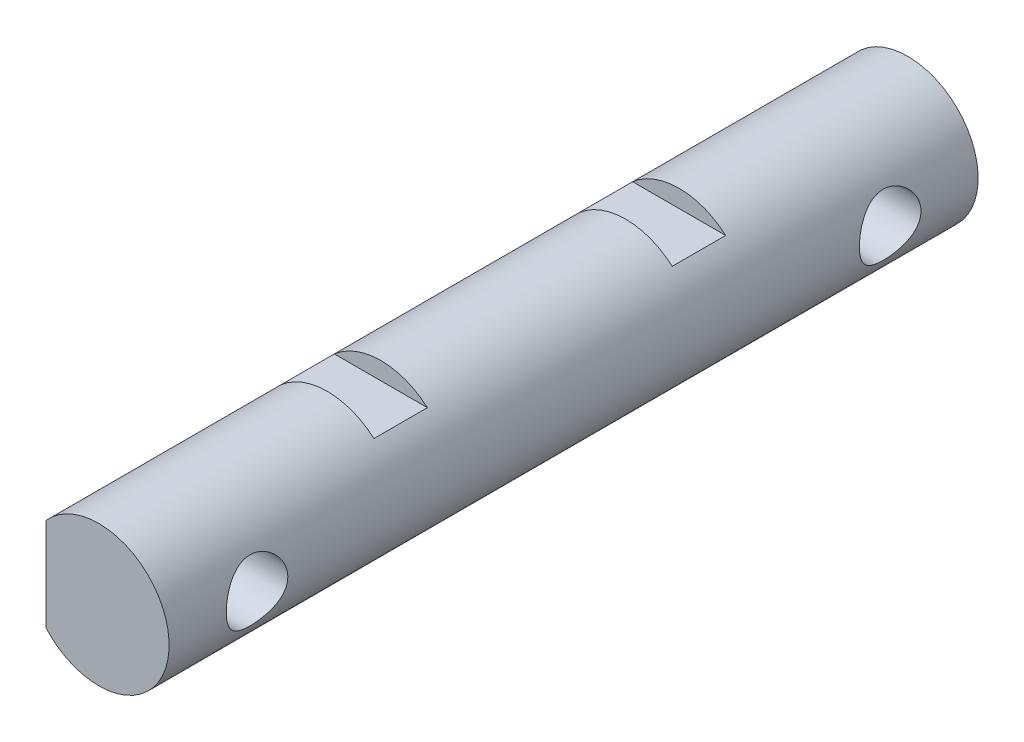
ISO-10303-21;
HEADER;
FILE_DESCRIPTION(('STEP AP214'),'2;1');
FILE_NAME('part.step','',(''),(''),'','','');
FILE_SCHEMA(('AUTOMOTIVE_DESIGN { 1 0 10303 214 1 1 1 1 }'));
ENDSEC;
DATA;
#1=APPLICATION_CONTEXT('core data for automotive mechanical design processes');
#2=APPLICATION_PROTOCOL_DEFINITION('international standard','automotive_design',2000,#1);
#3=PRODUCT_CONTEXT('',#1,'mechanical');
#4=PRODUCT('Part','Part','',(#3));
#5=PRODUCT_RELATED_PRODUCT_CATEGORY('part','',(#4));
#6=PRODUCT_DEFINITION_FORMATION('','',#4);
#7=PRODUCT_DEFINITION_CONTEXT('part definition',#1,'design');
#8=PRODUCT_DEFINITION('design','',#6,#7);
#9=PRODUCT_DEFINITION_SHAPE('','',#8);
#10=(LENGTH_UNIT() NAMED_UNIT(*) SI_UNIT(.MILLI.,.METRE.));
#11=(NAMED_UNIT(*) PLANE_ANGLE_UNIT() SI_UNIT($,.RADIAN.));
#12=(NAMED_UNIT(*) SI_UNIT($,.STERADIAN.) SOLID_ANGLE_UNIT());
#13=UNCERTAINTY_MEASURE_WITH_UNIT(LENGTH_MEASURE(1.E-05),#10,'distance_accuracy_value','');
#14=(GEOMETRIC_REPRESENTATION_CONTEXT(3) GLOBAL_UNCERTAINTY_ASSIGNED_CONTEXT((#13)) GLOBAL_UNIT_ASSIGNED_CONTEXT((#10,
#11,#12)) REPRESENTATION_CONTEXT('',''));
#15=CARTESIAN_POINT('',(0.,0.,0.));
#16=DIRECTION('',(0.,0.,1.));
#17=DIRECTION('',(1.,0.,0.));
#18=AXIS2_PLACEMENT_3D('',#15,#16,#17);
#19=CARTESIAN_POINT('',(0.,0.,115.));
#20=DIRECTION('',(0.,0.,-1.));
#21=DIRECTION('',(-1.,0.,0.));
#22=AXIS2_PLACEMENT_3D('',#19,#20,#21);
#23=CYLINDRICAL_SURFACE('',#22,20.);
#24=CARTESIAN_POINT('',(20.,0.,-81.25));
#25=CARTESIAN_POINT('',(19.9999985682897,0.233416367921879,-81.2500017303169));
#26=CARTESIAN_POINT('',(19.9959028919335,0.466897181927741,-81.2593522904093));
#27=CARTESIAN_POINT('',(19.9796218084749,0.932182866900446,-81.2966637878134));
#28=CARTESIAN_POINT('',(19.9674316527818,1.16398667331765,-81.3246356492544));
#29=CARTESIAN_POINT('',(19.9352486175407,1.6245806234382,-81.3989673695291));
#30=CARTESIAN_POINT('',(19.9152394614096,1.85336344466846,-81.4453655892734));
#31=CARTESIAN_POINT('',(19.8679406236122,2.30579299929019,-81.5560633626645));
#32=CARTESIAN_POINT('',(19.8406504278313,2.52943936878496,-81.6203641804286));
#33=CARTESIAN_POINT('',(19.7795964252379,2.96929138578268,-81.7659679290259));
#34=CARTESIAN_POINT('',(19.745856463693,3.18552108433365,-81.8472083303572));
#35=CARTESIAN_POINT('',(19.6726658379185,3.61007304407575,-82.0261087980079));
#36=CARTESIAN_POINT('',(19.6332149893594,3.81839504975724,-82.1237693943362));
#37=CARTESIAN_POINT('',(19.5495629853909,4.22585197573271,-82.3346705229718));
#38=CARTESIAN_POINT('',(19.5053642657504,4.42499153259712,-82.447903074778));
#39=CARTESIAN_POINT('',(19.413206492756,4.81323611811152,-82.6892186748929));
#40=CARTESIAN_POINT('',(19.3652460736154,5.00233745994071,-82.8173071251928));
#41=CARTESIAN_POINT('',(19.2642312719407,5.37858581774582,-83.094167099455));
#42=CARTESIAN_POINT('',(19.2110422940749,5.56517514897222,-83.2436476552317));
#43=CARTESIAN_POINT('',(19.1030551983712,5.92525275175357,-83.5571074171698));
#44=CARTESIAN_POINT('',(19.0482570130114,6.09874047247459,-83.7210872322982));
#45=CARTESIAN_POINT('',(18.9383820612165,6.43183221506636,-84.0627452772295));
#46=CARTESIAN_POINT('',(18.883305123659,6.59142622484844,-84.240433214284));
#47=CARTESIAN_POINT('',(18.7743404202813,6.89566879546979,-84.6084113335879));
#48=CARTESIAN_POINT('',(18.7204522726647,7.04032221130419,-84.7986973888445));
#49=CARTESIAN_POINT('',(18.6123288995023,7.32155503276978,-85.2019695808427));
#50=CARTESIAN_POINT('',(18.5582436168454,7.4572270137637,-85.415630278337));
#51=CARTESIAN_POINT('',(18.4546966220335,7.70991691228354,-85.8546649649059));
#52=CARTESIAN_POINT('',(18.4052329873663,7.82694260070719,-86.080034022286));
#53=CARTESIAN_POINT('',(18.3125730614567,8.04135028147738,-86.5411258918948));
#54=CARTESIAN_POINT('',(18.2693754498558,8.13873641390775,-86.7768465091947));
#55=CARTESIAN_POINT('',(18.1907994751913,8.31287883922288,-87.257052958165));
#56=CARTESIAN_POINT('',(18.1554204624836,8.38963684620414,-87.5015380596348));
#57=CARTESIAN_POINT('',(18.0954362681584,8.51821340152746,-87.9846194184995));
#58=CARTESIAN_POINT('',(18.0703701388388,8.57111258186955,-88.2228707067972));
#59=CARTESIAN_POINT('',(18.0294324322847,8.65689526382216,-88.7037361082106));
#60=CARTESIAN_POINT('',(18.0135605455664,8.68977943915172,-88.9463500741924));
#61=CARTESIAN_POINT('',(17.9916327120487,8.73508952672777,-89.4337914323461));
#62=CARTESIAN_POINT('',(17.9855714055796,8.74752660959159,-89.6786175424212));
#63=CARTESIAN_POINT('',(17.9834899888763,8.7518054468894,-90.1684851777584));
#64=CARTESIAN_POINT('',(17.9874692647386,8.74364846049057,-90.4135266889346));
#65=CARTESIAN_POINT('',(18.0045331345594,8.70845084190264,-90.8805656542909));
#66=CARTESIAN_POINT('',(18.0168005237286,8.6831043064201,-91.1027233114223));
#67=CARTESIAN_POINT('',(18.0491801392189,8.61559618918829,-91.5439654060083));
#68=CARTESIAN_POINT('',(18.0692950381461,8.57342887872088,-91.7630487700971));
#69=CARTESIAN_POINT('',(18.1167315816365,8.47272838547803,-92.1965626406387));
#70=CARTESIAN_POINT('',(18.1440516602179,8.41419875874098,-92.4109941471848));
#71=CARTESIAN_POINT('',(18.2050933156789,8.28129942266781,-92.8340359275819));
#72=CARTESIAN_POINT('',(18.238817371207,8.20692357871598,-93.0426439114703));
#73=CARTESIAN_POINT('',(18.3125016849266,8.041186429471,-93.457274887532));
#74=CARTESIAN_POINT('',(18.3525817611961,7.94949048772445,-93.6631426430701));
#75=CARTESIAN_POINT('',(18.437328669377,7.75090729425108,-94.066508674859));
#76=CARTESIAN_POINT('',(18.4819970433319,7.64401493061795,-94.264004105613));
#77=CARTESIAN_POINT('',(18.5747583551245,7.41576193817174,-94.6496438941624));
#78=CARTESIAN_POINT('',(18.6228518562144,7.29439892748073,-94.8377867052691));
#79=CARTESIAN_POINT('',(18.7212818714958,7.03793082479619,-95.2038428374211));
#80=CARTESIAN_POINT('',(18.7716185028415,6.90282501457126,-95.3817556230596));
#81=CARTESIAN_POINT('',(18.8781652203288,6.60620846933538,-95.7428323034792));
#82=CARTESIAN_POINT('',(18.9344814201868,6.44340914271176,-95.9249082343613));
#83=CARTESIAN_POINT('',(19.0468698375146,6.10318229259406,-96.2748066540378));
#84=CARTESIAN_POINT('',(19.1029421189477,5.92575888215258,-96.4426331237457));
#85=CARTESIAN_POINT('',(19.2134309096362,5.55707865816541,-96.7632156578912));
#86=CARTESIAN_POINT('',(19.2678463106134,5.36581286228932,-96.9159617819429));
#87=CARTESIAN_POINT('',(19.3735462387861,4.9706653510031,-97.2052002862634));
#88=CARTESIAN_POINT('',(19.4248320109594,4.76678871808314,-97.3416991505637));
#89=CARTESIAN_POINT('',(19.524345510228,4.34153752909835,-97.6011399740506));
#90=CARTESIAN_POINT('',(19.5724451978511,4.11983064347502,-97.7235874438474));
#91=CARTESIAN_POINT('',(19.662553731652,3.66572386612662,-97.949164101266));
#92=CARTESIAN_POINT('',(19.7045652359893,3.43332869974906,-98.0523017255301));
#93=CARTESIAN_POINT('',(19.7812866535513,2.95944070582797,-98.2382630084731));
#94=CARTESIAN_POINT('',(19.8159984579112,2.71795025376601,-98.3210919294585));
#95=CARTESIAN_POINT('',(19.8770833195401,2.22768004101849,-98.4655319416447));
#96=CARTESIAN_POINT('',(19.9034570846219,1.97890090102697,-98.5271448339056));
#97=CARTESIAN_POINT('',(19.9455590411339,1.49330425714449,-98.6249424117708));
#98=CARTESIAN_POINT('',(19.9618912732178,1.25683023419061,-98.6625763750426));
#99=CARTESIAN_POINT('',(19.9861570452404,0.781167692050503,-98.7183489298271));
#100=CARTESIAN_POINT('',(19.9940909660847,0.541979296472109,-98.7364884055134));
#101=CARTESIAN_POINT('',(20.0013359162517,0.0628582888385495,-98.7530562283168));
#102=CARTESIAN_POINT('',(20.0006493576702,-0.177074096255999,-98.7514900892607));
#103=CARTESIAN_POINT('',(19.9906783453544,-0.655817583136368,-98.7286784296819));
#104=CARTESIAN_POINT('',(19.981394120491,-0.894628714600027,-98.7074334330132));
#105=CARTESIAN_POINT('',(19.9552475257964,-1.35588905000023,-98.6472589988417));
#106=CARTESIAN_POINT('',(19.9388402911306,-1.57850362116399,-98.6093903411313));
#107=CARTESIAN_POINT('',(19.8990001453749,-2.01961663268736,-98.5167163572472));
#108=CARTESIAN_POINT('',(19.8755648011915,-2.23811361967429,-98.4619051654578));
#109=CARTESIAN_POINT('',(19.8222427070808,-2.66943964596279,-98.3358899562597));
#110=CARTESIAN_POINT('',(19.7923578883041,-2.88227036051983,-98.2646908454226));
#111=CARTESIAN_POINT('',(19.7268200799402,-3.30114073096866,-98.1064858772219));
#112=CARTESIAN_POINT('',(19.6911648905558,-3.5071777607512,-98.0194739901052));
#113=CARTESIAN_POINT('',(19.6137264975705,-3.91748070243589,-97.8274340405093));
#114=CARTESIAN_POINT('',(19.5717881504754,-4.12149578164153,-97.7219328997091));
#115=CARTESIAN_POINT('',(19.4836198618351,-4.51998007628509,-97.4956521585888));
#116=CARTESIAN_POINT('',(19.4373884570328,-4.71444600218199,-97.374867343816));
#117=CARTESIAN_POINT('',(19.3416970408793,-5.09282313622921,-97.1188372223305));
#118=CARTESIAN_POINT('',(19.2922364212025,-5.27673234335102,-96.9835891879296));
#119=CARTESIAN_POINT('',(19.1912125422397,-5.63308689802626,-96.6994603303996));
#120=CARTESIAN_POINT('',(19.1396491826948,-5.80553169792173,-96.5505788568037));
#121=CARTESIAN_POINT('',(19.031494802915,-6.15122178914183,-96.2277764779103));
#122=CARTESIAN_POINT('',(18.9748270422481,-6.32346569091558,-96.0528073225217));
#123=CARTESIAN_POINT('',(18.8619292479006,-6.65266136761671,-95.68900372024));
#124=CARTESIAN_POINT('',(18.8056990900515,-6.80961763762721,-95.5001733778186));
#125=CARTESIAN_POINT('',(18.6951642097626,-7.10746725066208,-95.1094801621223));
#126=CARTESIAN_POINT('',(18.6408608892102,-7.24834905724263,-94.9076080896822));
#127=CARTESIAN_POINT('',(18.535812825537,-7.51291550604162,-94.492129593069));
#128=CARTESIAN_POINT('',(18.4850666099046,-7.63660728539164,-94.2785280905421));
#129=CARTESIAN_POINT('',(18.387624680319,-7.8683804484288,-93.8359887435348));
#130=CARTESIAN_POINT('',(18.341039902598,-7.97606771254281,-93.6068195181512));
#131=CARTESIAN_POINT('',(18.2548053266785,-8.17150523082147,-93.1389857013622));
#132=CARTESIAN_POINT('',(18.2151522927588,-8.25926479293991,-92.9003256044805));
#133=CARTESIAN_POINT('',(18.1442391070702,-8.41390698160729,-92.4152499053907));
#134=CARTESIAN_POINT('',(18.1129744344038,-8.48080085686747,-92.1688385610405));
#135=CARTESIAN_POINT('',(18.0600496403039,-8.59293128647412,-91.6701288394078));
#136=CARTESIAN_POINT('',(18.0383884809987,-8.63817018116166,-91.4178311013838));
#137=CARTESIAN_POINT('',(18.0069299395797,-8.70354344878578,-90.930661727657));
#138=CARTESIAN_POINT('',(17.9962975967587,-8.72544876294636,-90.6960803000314));
#139=CARTESIAN_POINT('',(17.9842477989203,-8.75025874876469,-90.2256826663951));
#140=CARTESIAN_POINT('',(17.9828298124322,-8.75316451628882,-89.9898665323858));
#141=CARTESIAN_POINT('',(17.9892603439818,-8.73994069061711,-89.5189408167359));
#142=CARTESIAN_POINT('',(17.9971072555545,-8.7238143974404,-89.28383111969));
#143=CARTESIAN_POINT('',(18.0217777612109,-8.67273474775619,-88.816148396522));
#144=CARTESIAN_POINT('',(18.0386012341389,-8.63778164535197,-88.5835753362064));
#145=CARTESIAN_POINT('',(18.0794282620671,-8.55198143492335,-88.1358421066861));
#146=CARTESIAN_POINT('',(18.1029693504652,-8.50215066313961,-87.9204435801649));
#147=CARTESIAN_POINT('',(18.1567945375324,-8.38658886339941,-87.4947470220163));
#148=CARTESIAN_POINT('',(18.1870809425705,-8.32085239627778,-87.2844507623025));
#149=CARTESIAN_POINT('',(18.2535204371937,-8.17407322128961,-86.8702580664674));
#150=CARTESIAN_POINT('',(18.2896726914394,-8.09303269256367,-86.6663607240208));
#151=CARTESIAN_POINT('',(18.3668695319391,-7.91627435755398,-86.2659601792657));
#152=CARTESIAN_POINT('',(18.4079159047127,-7.82055118793234,-86.0694597117179));
#153=CARTESIAN_POINT('',(18.5422447679324,-7.49941530860123,-85.4683551208831));
#154=CARTESIAN_POINT('',(18.6423659519066,-7.24920371149605,-85.0781997453864));
#155=CARTESIAN_POINT('',(18.8497074148774,-6.69154355795391,-84.3432575523569));
#156=CARTESIAN_POINT('',(18.9569305275224,-6.38407206526289,-83.9984890099501));
#157=CARTESIAN_POINT('',(19.1198196151912,-5.87098416262185,-83.5071956711232));
#158=CARTESIAN_POINT('',(19.1766258281905,-5.68314281886581,-83.3421483690425));
#159=CARTESIAN_POINT('',(19.2877874558158,-5.29360126833499,-83.0284316404947));
#160=CARTESIAN_POINT('',(19.3421436486089,-5.09190551406016,-82.8797569918372));
#161=CARTESIAN_POINT('',(19.4469644177556,-4.67564769051748,-82.5997435523725));
#162=CARTESIAN_POINT('',(19.4974261644507,-4.46107646359371,-82.4684173183182));
#163=CARTESIAN_POINT('',(19.5930172766361,-4.02050543970385,-82.2243043991115));
#164=CARTESIAN_POINT('',(19.6381470586734,-3.79450653746997,-82.1115162654446));
#165=CARTESIAN_POINT('',(19.7212623886228,-3.33549324478625,-81.9068344644796));
#166=CARTESIAN_POINT('',(19.7593312612624,-3.10260413019321,-81.8146940140012));
#167=CARTESIAN_POINT('',(19.8279278680938,-2.62879313679702,-81.6504614033736));
#168=CARTESIAN_POINT('',(19.8584564121088,-2.38787212376822,-81.5783670901861));
#169=CARTESIAN_POINT('',(19.9110037914844,-1.90048834138157,-81.4551964866165));
#170=CARTESIAN_POINT('',(19.9330446920011,-1.6540417283201,-81.4040656751191));
#171=CARTESIAN_POINT('',(19.9680480307584,-1.15715012404687,-81.3232043596432));
#172=CARTESIAN_POINT('',(19.9810168662317,-0.906708077963216,-81.2934587753042));
#173=CARTESIAN_POINT('',(19.9928335024629,-0.546384240388737,-81.2663907881835));
#174=CARTESIAN_POINT('',(19.9955189863611,-0.437221175106716,-81.2602464388677));
#175=CARTESIAN_POINT('',(19.9991025786908,-0.218710123374722,-81.2520506207327));
#176=CARTESIAN_POINT('',(20.0000006707965,-0.109362135244817,-81.2499991892978));
#177=CARTESIAN_POINT('',(20.,0.,-81.25));
#178=B_SPLINE_CURVE_WITH_KNOTS('',3,(#24,#25,#26,#27,#28,#29,#30,#31,#32,#33,#34,#35,#36,#37,
#38,#39,#40,#41,#42,#43,#44,#45,#46,#47,#48,#49,#50,#51,#52,#53,#54,#55,#56,#57,#58,#59,#60,#61,
#62,#63,#64,#65,#66,#67,#68,#69,#70,#71,#72,#73,#74,#75,#76,#77,#78,#79,#80,#81,#82,#83,#84,#85,
#86,#87,#88,#89,#90,#91,#92,#93,#94,#95,#96,#97,#98,#99,#100,#101,#102,#103,#104,#105,#106,#107,
#108,#109,#110,#111,#112,#113,#114,#115,#116,#117,#118,#119,#120,#121,#122,#123,#124,#125,#126,
#127,#128,#129,#130,#131,#132,#133,#134,#135,#136,#137,#138,#139,#140,#141,#142,#143,#144,#145,
#146,#147,#148,#149,#150,#151,#152,#153,#154,#155,#156,#157,#158,#159,#160,#161,#162,#163,#164,
#165,#166,#167,#168,#169,#170,#171,#172,#173,#174,#175,#176,#177),.UNSPECIFIED.,.T.,.F.,(4,2,2,
2,2,2,2,2,2,2,2,2,2,2,2,2,2,2,2,2,2,2,2,2,2,2,2,2,2,2,2,2,2,2,2,2,2,2,2,2,2,2,2,2,2,2,2,2,2,2,2,
2,2,2,2,2,2,2,2,2,2,2,2,2,2,2,2,2,2,2,2,2,2,2,2,2,4),(0.,0.700138962448547,1.40068902165195,
2.10270523117984,2.80477102323212,3.50428974134297,4.20383104276542,4.90301516177155,
5.602454324162,6.3364344495926,7.07044541675262,7.8049810227005,8.53927718292008,
9.31474372641262,10.0898862418188,10.864865183401,11.6397797080911,12.3747938090443,
13.1097831675412,13.8443708544322,14.578913628086,15.249931889376,15.9211788774009,
16.5922800959133,17.2636415944116,17.9496241084891,18.6358379278343,19.3221648547531,
20.0085276691972,20.7596400951171,21.5105419853374,22.2619355821616,23.0130282967321,
23.7854301441305,24.5574937307648,25.3293570515791,26.1011548316092,26.8202411588828,
27.539294870575,28.2581473883713,28.9769807707686,29.6554224079058,30.3340991895346,
31.0125730378642,31.6913061478678,32.3909830302794,33.0908992739318,33.7909477517266,
34.4910296470403,35.2461100596148,36.0009677783824,36.7563638861383,37.511445417779,
38.2828087910349,39.0538111265976,39.8243970928256,40.5948997599072,41.3014981388369,
42.0080557618342,42.7144908909413,43.4209164856137,44.0871890279352,44.7536897338687,
45.4200956084324,46.0867454928628,47.5030044483908,48.9198319313131,49.6883182882484,
50.4565588159233,51.2253523832027,51.9940858505524,52.7530728136298,53.5119782268422,
54.2688971911303,55.0252818689775,55.3533136742166,55.6813484756453),.UNSPECIFIED.);
#179=CARTESIAN_POINT('',(20.,0.,-81.25));
#180=VERTEX_POINT('',#179);
#181=EDGE_CURVE('E42',#180,#180,#178,.T.);
#182=ORIENTED_EDGE('',*,*,#181,.T.);
#183=EDGE_LOOP('',(#182));
#184=FACE_BOUND('',#183,.T.);
#185=DIRECTION('',(0.,0.,-1.));
#186=VECTOR('',#185,1.);
#187=CARTESIAN_POINT('',(13.228756555323,15.,115.));
#188=LINE('',#187,#186);
#189=CARTESIAN_POINT('',(13.228756555323,15.,50.));
#190=VERTEX_POINT('',#189);
#191=CARTESIAN_POINT('',(13.228756555323,15.,34.8));
#192=VERTEX_POINT('',#191);
#193=EDGE_CURVE('E204',#190,#192,#188,.T.);
#194=ORIENTED_EDGE('',*,*,#193,.F.);
#195=CARTESIAN_POINT('',(0.,0.,50.));
#196=DIRECTION('',(0.,0.,1.));
#197=DIRECTION('',(1.,0.,0.));
#198=AXIS2_PLACEMENT_3D('',#195,#196,#197);
#199=CIRCLE('',#198,20.);
#200=CARTESIAN_POINT('',(-13.228756555323,15.,50.));
#201=VERTEX_POINT('',#200);
#202=EDGE_CURVE('E196',#190,#201,#199,.T.);
#203=ORIENTED_EDGE('',*,*,#202,.T.);
#204=DIRECTION('',(0.,0.,-1.));
#205=VECTOR('',#204,1.);
#206=CARTESIAN_POINT('',(-13.228756555323,15.,115.));
#207=LINE('',#206,#205);
#208=CARTESIAN_POINT('',(-13.228756555323,15.,34.8));
#209=VERTEX_POINT('',#208);
#210=EDGE_CURVE('E202',#209,#201,#207,.F.);
#211=ORIENTED_EDGE('',*,*,#210,.F.);
#212=CARTESIAN_POINT('',(0.,0.,34.8));
#213=DIRECTION('',(0.,0.,1.));
#214=DIRECTION('',(1.,0.,0.));
#215=AXIS2_PLACEMENT_3D('',#212,#213,#214);
#216=CIRCLE('',#215,20.);
#217=EDGE_CURVE('E200',#192,#209,#216,.T.);
#218=ORIENTED_EDGE('',*,*,#217,.F.);
#219=EDGE_LOOP('',(#194,#203,#211,#218));
#220=FACE_BOUND('',#219,.T.);
#221=DIRECTION('',(0.,0.,-1.));
#222=VECTOR('',#221,1.);
#223=CARTESIAN_POINT('',(-13.228756555323,-15.,115.));
#224=LINE('',#223,#222);
#225=CARTESIAN_POINT('',(-13.228756555323,-15.,50.));
#226=VERTEX_POINT('',#225);
#227=CARTESIAN_POINT('',(-13.228756555323,-15.,34.8));
#228=VERTEX_POINT('',#227);
#229=EDGE_CURVE('E199',#226,#228,#224,.T.);
#230=ORIENTED_EDGE('',*,*,#229,.F.);
#231=CARTESIAN_POINT('',(13.228756555323,-15.,50.));
#232=VERTEX_POINT('',#231);
#233=EDGE_CURVE('E192',#226,#232,#199,.T.);
#234=ORIENTED_EDGE('',*,*,#233,.T.);
#235=DIRECTION('',(0.,0.,-1.));
#236=VECTOR('',#235,1.);
#237=CARTESIAN_POINT('',(13.228756555323,-15.,115.));
#238=LINE('',#237,#236);
#239=CARTESIAN_POINT('',(13.228756555323,-15.,34.8));
#240=VERTEX_POINT('',#239);
#241=EDGE_CURVE('E189',#240,#232,#238,.F.);
#242=ORIENTED_EDGE('',*,*,#241,.F.);
#243=EDGE_CURVE('E195',#228,#240,#216,.T.);
#244=ORIENTED_EDGE('',*,*,#243,.F.);
#245=EDGE_LOOP('',(#230,#234,#242,#244));
#246=FACE_BOUND('',#245,.T.);
#247=CARTESIAN_POINT('',(0.,0.,115.));
#248=DIRECTION('',(0.,0.,1.));
#249=DIRECTION('',(1.,0.,0.));
#250=AXIS2_PLACEMENT_3D('',#247,#248,#249);
#251=CIRCLE('',#250,20.);
#252=CARTESIAN_POINT('',(-15.,-13.228756555323,115.));
#253=VERTEX_POINT('',#252);
#254=CARTESIAN_POINT('',(-15.,13.228756555323,115.));
#255=VERTEX_POINT('',#254);
#256=EDGE_CURVE('E186',#253,#255,#251,.T.);
#257=ORIENTED_EDGE('',*,*,#256,.F.);
#258=DIRECTION('',(0.,0.,1.));
#259=VECTOR('',#258,1.);
#260=CARTESIAN_POINT('',(-15.,-13.228756555323,65.));
#261=LINE('',#260,#259);
#262=CARTESIAN_POINT('',(-15.,-13.228756555323,65.));
#263=VERTEX_POINT('',#262);
#264=EDGE_CURVE('E170',#263,#253,#261,.T.);
#265=ORIENTED_EDGE('',*,*,#264,.F.);
#266=CARTESIAN_POINT('',(0.,0.,65.));
#267=DIRECTION('',(0.,0.,1.));
#268=DIRECTION('',(1.,0.,0.));
#269=AXIS2_PLACEMENT_3D('',#266,#267,#268);
#270=CIRCLE('',#269,20.);
#271=CARTESIAN_POINT('',(-15.,13.228756555323,65.));
#272=VERTEX_POINT('',#271);
#273=EDGE_CURVE('E164',#272,#263,#270,.T.);
#274=ORIENTED_EDGE('',*,*,#273,.F.);
#275=DIRECTION('',(0.,0.,1.));
#276=VECTOR('',#275,1.);
#277=CARTESIAN_POINT('',(-15.,13.228756555323,65.));
#278=LINE('',#277,#276);
#279=EDGE_CURVE('E172',#272,#255,#278,.T.);
#280=ORIENTED_EDGE('',*,*,#279,.T.);
#281=EDGE_LOOP('',(#257,#265,#274,#280));
#282=FACE_BOUND('',#281,.T.);
#283=CARTESIAN_POINT('',(20.,0.,98.75));
#284=CARTESIAN_POINT('',(19.9999985682897,0.233416367921879,98.7499982696831));
#285=CARTESIAN_POINT('',(19.9959028919335,0.466897181927741,98.7406477095907));
#286=CARTESIAN_POINT('',(19.9796218084749,0.932182866900446,98.7033362121866));
#287=CARTESIAN_POINT('',(19.9674316527818,1.16398667331765,98.6753643507456));
#288=CARTESIAN_POINT('',(19.9352486175407,1.6245806234382,98.6010326304709));
#289=CARTESIAN_POINT('',(19.9152394614096,1.85336344466846,98.5546344107266));
#290=CARTESIAN_POINT('',(19.8679406236122,2.30579299929019,98.4439366373355));
#291=CARTESIAN_POINT('',(19.8406504278313,2.52943936878496,98.3796358195714));
#292=CARTESIAN_POINT('',(19.7795964252379,2.96929138578268,98.2340320709741));
#293=CARTESIAN_POINT('',(19.745856463693,3.18552108433365,98.1527916696428));
#294=CARTESIAN_POINT('',(19.6726658379185,3.61007304407575,97.9738912019921));
#295=CARTESIAN_POINT('',(19.6332149893594,3.81839504975724,97.8762306056638));
#296=CARTESIAN_POINT('',(19.5495629853909,4.22585197573271,97.6653294770282));
#297=CARTESIAN_POINT('',(19.5053642657504,4.42499153259711,97.552096925222));
#298=CARTESIAN_POINT('',(19.413206492756,4.81323611811152,97.3107813251071));
#299=CARTESIAN_POINT('',(19.3652460736154,5.00233745994071,97.1826928748072));
#300=CARTESIAN_POINT('',(19.2642312719407,5.37858581774581,96.905832900545));
#301=CARTESIAN_POINT('',(19.2110422940749,5.56517514897221,96.7563523447683));
#302=CARTESIAN_POINT('',(19.1030551983712,5.92525275175356,96.4428925828302));
#303=CARTESIAN_POINT('',(19.0482570130114,6.09874047247459,96.2789127677018));
#304=CARTESIAN_POINT('',(18.9383820612165,6.43183221506635,95.9372547227705));
#305=CARTESIAN_POINT('',(18.883305123659,6.59142622484842,95.759566785716));
#306=CARTESIAN_POINT('',(18.7743404202813,6.89566879546979,95.3915886664121));
#307=CARTESIAN_POINT('',(18.7204522726647,7.04032221130419,95.2013026111555));
#308=CARTESIAN_POINT('',(18.6123288995023,7.32155503276978,94.7980304191572));
#309=CARTESIAN_POINT('',(18.5582436168454,7.4572270137637,94.584369721663));
#310=CARTESIAN_POINT('',(18.4546966220335,7.70991691228354,94.1453350350941));
#311=CARTESIAN_POINT('',(18.4052329873663,7.82694260070719,93.919965977714));
#312=CARTESIAN_POINT('',(18.3125730614567,8.04135028147738,93.4588741081052));
#313=CARTESIAN_POINT('',(18.2693754498558,8.13873641390775,93.2231534908053));
#314=CARTESIAN_POINT('',(18.1907994751913,8.31287883922288,92.742947041835));
#315=CARTESIAN_POINT('',(18.1554204624836,8.38963684620414,92.4984619403652));
#316=CARTESIAN_POINT('',(18.0954362681584,8.51821340152746,92.0153805815005));
#317=CARTESIAN_POINT('',(18.0703701388388,8.57111258186955,91.7771292932028));
#318=CARTESIAN_POINT('',(18.0294324322847,8.65689526382216,91.2962638917894));
#319=CARTESIAN_POINT('',(18.0135605455664,8.68977943915172,91.0536499258076));
#320=CARTESIAN_POINT('',(17.9916327120487,8.73508952672777,90.5662085676539));
#321=CARTESIAN_POINT('',(17.9855714055796,8.74752660959159,90.3213824575788));
#322=CARTESIAN_POINT('',(17.9834899888763,8.7518054468894,89.8315148222416));
#323=CARTESIAN_POINT('',(17.9874692647386,8.74364846049057,89.5864733110653));
#324=CARTESIAN_POINT('',(18.0045331345594,8.70845084190264,89.119434345709));
#325=CARTESIAN_POINT('',(18.0168005237286,8.6831043064201,88.8972766885776));
#326=CARTESIAN_POINT('',(18.0491801392189,8.61559618918829,88.4560345939917));
#327=CARTESIAN_POINT('',(18.0692950381461,8.57342887872088,88.2369512299029));
#328=CARTESIAN_POINT('',(18.1167315816365,8.47272838547803,87.8034373593613));
#329=CARTESIAN_POINT('',(18.1440516602179,8.41419875874098,87.5890058528152));
#330=CARTESIAN_POINT('',(18.2050933156789,8.28129942266781,87.1659640724181));
#331=CARTESIAN_POINT('',(18.238817371207,8.20692357871598,86.9573560885297));
#332=CARTESIAN_POINT('',(18.3125016849266,8.041186429471,86.542725112468));
#333=CARTESIAN_POINT('',(18.3525817611961,7.94949048772445,86.3368573569299));
#334=CARTESIAN_POINT('',(18.437328669377,7.75090729425109,85.933491325141));
#335=CARTESIAN_POINT('',(18.4819970433319,7.64401493061797,85.735995894387));
#336=CARTESIAN_POINT('',(18.5747583551245,7.41576193817175,85.3503561058376));
#337=CARTESIAN_POINT('',(18.6228518562143,7.29439892748074,85.1622132947309));
#338=CARTESIAN_POINT('',(18.7212818714958,7.0379308247962,84.7961571625789));
#339=CARTESIAN_POINT('',(18.7716185028415,6.90282501457126,84.6182443769404));
#340=CARTESIAN_POINT('',(18.8781652203288,6.60620846933538,84.2571676965208));
#341=CARTESIAN_POINT('',(18.9344814201868,6.44340914271176,84.0750917656387));
#342=CARTESIAN_POINT('',(19.0468698375146,6.10318229259406,83.7251933459622));
#343=CARTESIAN_POINT('',(19.1029421189477,5.92575888215258,83.5573668762543));
#344=CARTESIAN_POINT('',(19.2134309096362,5.5570786581654,83.2367843421088));
#345=CARTESIAN_POINT('',(19.2678463106134,5.36581286228931,83.0840382180571));
#346=CARTESIAN_POINT('',(19.3735462387862,4.9706653510031,82.7947997137366));
#347=CARTESIAN_POINT('',(19.4248320109594,4.76678871808314,82.6583008494363));
#348=CARTESIAN_POINT('',(19.524345510228,4.34153752909835,82.3988600259494));
#349=CARTESIAN_POINT('',(19.5724451978511,4.11983064347502,82.2764125561526));
#350=CARTESIAN_POINT('',(19.662553731652,3.66572386612662,82.0508358987339));
#351=CARTESIAN_POINT('',(19.7045652359893,3.43332869974906,81.9476982744698));
#352=CARTESIAN_POINT('',(19.7812866535513,2.95944070582797,81.7617369915269));
#353=CARTESIAN_POINT('',(19.8159984579112,2.71795025376601,81.6789080705415));
#354=CARTESIAN_POINT('',(19.8770833195401,2.22768004101849,81.5344680583553));
#355=CARTESIAN_POINT('',(19.9034570846219,1.97890090102697,81.4728551660944));
#356=CARTESIAN_POINT('',(19.9455590411339,1.49330425714449,81.3750575882292));
#357=CARTESIAN_POINT('',(19.9618912732178,1.25683023419061,81.3374236249573));
#358=CARTESIAN_POINT('',(19.9861570452404,0.781167692050503,81.2816510701729));
#359=CARTESIAN_POINT('',(19.9940909660847,0.541979296472109,81.2635115944866));
#360=CARTESIAN_POINT('',(20.0013359162517,0.0628582888385496,81.2469437716832));
#361=CARTESIAN_POINT('',(20.0006493576702,-0.177074096255999,81.2485099107393));
#362=CARTESIAN_POINT('',(19.9906783453544,-0.655817583136368,81.2713215703181));
#363=CARTESIAN_POINT('',(19.981394120491,-0.894628714600027,81.2925665669868));
#364=CARTESIAN_POINT('',(19.9552475257964,-1.35588905000023,81.3527410011583));
#365=CARTESIAN_POINT('',(19.9388402911306,-1.57850362116399,81.3906096588687));
#366=CARTESIAN_POINT('',(19.8990001453749,-2.01961663268737,81.4832836427527));
#367=CARTESIAN_POINT('',(19.8755648011915,-2.23811361967429,81.5380948345422));
#368=CARTESIAN_POINT('',(19.8222427070808,-2.66943964596279,81.6641100437403));
#369=CARTESIAN_POINT('',(19.7923578883041,-2.88227036051984,81.7353091545774));
#370=CARTESIAN_POINT('',(19.7268200799402,-3.30114073096866,81.8935141227781));
#371=CARTESIAN_POINT('',(19.6911648905558,-3.5071777607512,81.9805260098948));
#372=CARTESIAN_POINT('',(19.6137264975705,-3.91748070243589,82.1725659594907));
#373=CARTESIAN_POINT('',(19.5717881504754,-4.12149578164154,82.2780671002909));
#374=CARTESIAN_POINT('',(19.4836198618351,-4.51998007628509,82.5043478414112));
#375=CARTESIAN_POINT('',(19.4373884570328,-4.714446002182,82.625132656184));
#376=CARTESIAN_POINT('',(19.3416970408793,-5.09282313622921,82.8811627776695));
#377=CARTESIAN_POINT('',(19.2922364212025,-5.27673234335102,83.0164108120703));
#378=CARTESIAN_POINT('',(19.1912125422397,-5.63308689802625,83.3005396696004));
#379=CARTESIAN_POINT('',(19.1396491826948,-5.80553169792172,83.4494211431963));
#380=CARTESIAN_POINT('',(19.031494802915,-6.15122178914183,83.7722235220897));
#381=CARTESIAN_POINT('',(18.9748270422481,-6.32346569091558,83.9471926774783));
#382=CARTESIAN_POINT('',(18.8619292479006,-6.6526613676167,84.31099627976));
#383=CARTESIAN_POINT('',(18.8056990900515,-6.8096176376272,84.4998266221814));
#384=CARTESIAN_POINT('',(18.6951642097626,-7.10746725066206,84.8905198378776));
#385=CARTESIAN_POINT('',(18.6408608892102,-7.24834905724262,85.0923919103178));
#386=CARTESIAN_POINT('',(18.535812825537,-7.51291550604162,85.507870406931));
#387=CARTESIAN_POINT('',(18.4850666099046,-7.63660728539163,85.7214719094579));
#388=CARTESIAN_POINT('',(18.387624680319,-7.8683804484288,86.1640112564652));
#389=CARTESIAN_POINT('',(18.341039902598,-7.97606771254281,86.3931804818488));
#390=CARTESIAN_POINT('',(18.2548053266785,-8.17150523082147,86.8610142986378));
#391=CARTESIAN_POINT('',(18.2151522927588,-8.25926479293991,87.0996743955195));
#392=CARTESIAN_POINT('',(18.1442391070702,-8.41390698160729,87.5847500946093));
#393=CARTESIAN_POINT('',(18.1129744344038,-8.48080085686747,87.8311614389595));
#394=CARTESIAN_POINT('',(18.0600496403039,-8.59293128647412,88.3298711605922));
#395=CARTESIAN_POINT('',(18.0383884809987,-8.63817018116166,88.5821688986162));
#396=CARTESIAN_POINT('',(18.0069299395797,-8.70354344878578,89.0693382723429));
#397=CARTESIAN_POINT('',(17.9962975967587,-8.72544876294636,89.3039196999686));
#398=CARTESIAN_POINT('',(17.9842477989203,-8.75025874876469,89.7743173336049));
#399=CARTESIAN_POINT('',(17.9828298124322,-8.75316451628882,90.0101334676142));
#400=CARTESIAN_POINT('',(17.9892603439818,-8.73994069061711,90.4810591832641));
#401=CARTESIAN_POINT('',(17.9971072555545,-8.7238143974404,90.71616888031));
#402=CARTESIAN_POINT('',(18.0217777612109,-8.67273474775619,91.183851603478));
#403=CARTESIAN_POINT('',(18.0386012341389,-8.63778164535197,91.4164246637936));
#404=CARTESIAN_POINT('',(18.0794282620671,-8.55198143492335,91.8641578933139));
#405=CARTESIAN_POINT('',(18.1029693504652,-8.50215066313961,92.0795564198351));
#406=CARTESIAN_POINT('',(18.1567945375324,-8.38658886339941,92.5052529779836));
#407=CARTESIAN_POINT('',(18.1870809425705,-8.32085239627778,92.7155492376975));
#408=CARTESIAN_POINT('',(18.2535204371937,-8.17407322128961,93.1297419335326));
#409=CARTESIAN_POINT('',(18.2896726914394,-8.09303269256367,93.3336392759792));
#410=CARTESIAN_POINT('',(18.3668695319391,-7.91627435755398,93.7340398207343));
#411=CARTESIAN_POINT('',(18.4079159047127,-7.82055118793234,93.9305402882821));
#412=CARTESIAN_POINT('',(18.5422447679324,-7.49941530860123,94.5316448791169));
#413=CARTESIAN_POINT('',(18.6423659519066,-7.24920371149605,94.9218002546136));
#414=CARTESIAN_POINT('',(18.8497074148774,-6.69154355795391,95.6567424476431));
#415=CARTESIAN_POINT('',(18.9569305275224,-6.38407206526289,96.0015109900499));
#416=CARTESIAN_POINT('',(19.1198196151912,-5.87098416262185,96.4928043288768));
#417=CARTESIAN_POINT('',(19.1766258281905,-5.68314281886581,96.6578516309575));
#418=CARTESIAN_POINT('',(19.2877874558158,-5.29360126833499,96.9715683595053));
#419=CARTESIAN_POINT('',(19.3421436486089,-5.09190551406016,97.1202430081628));
#420=CARTESIAN_POINT('',(19.4469644177556,-4.67564769051748,97.4002564476275));
#421=CARTESIAN_POINT('',(19.4974261644507,-4.46107646359372,97.5315826816818));
#422=CARTESIAN_POINT('',(19.5930172766361,-4.02050543970387,97.7756956008885));
#423=CARTESIAN_POINT('',(19.6381470586734,-3.79450653746998,97.8884837345554));
#424=CARTESIAN_POINT('',(19.7212623886228,-3.33549324478625,98.0931655355204));
#425=CARTESIAN_POINT('',(19.7593312612624,-3.10260413019322,98.1853059859988));
#426=CARTESIAN_POINT('',(19.8279278680938,-2.62879313679702,98.3495385966263));
#427=CARTESIAN_POINT('',(19.8584564121088,-2.38787212376822,98.4216329098139));
#428=CARTESIAN_POINT('',(19.9110037914844,-1.90048834138157,98.5448035133834));
#429=CARTESIAN_POINT('',(19.9330446920011,-1.6540417283201,98.5959343248809));
#430=CARTESIAN_POINT('',(19.9680480307584,-1.15715012404687,98.6767956403568));
#431=CARTESIAN_POINT('',(19.9810168662317,-0.906708077963217,98.7065412246957));
#432=CARTESIAN_POINT('',(19.9928335024629,-0.546384240388737,98.7336092118165));
#433=CARTESIAN_POINT('',(19.9955189863611,-0.437221175106716,98.7397535611323));
#434=CARTESIAN_POINT('',(19.9991025786908,-0.218710123374722,98.7479493792673));
#435=CARTESIAN_POINT('',(20.0000006707965,-0.109362135244817,98.7500008107021));
#436=CARTESIAN_POINT('',(20.,0.,98.75));
#437=B_SPLINE_CURVE_WITH_KNOTS('',3,(#283,#284,#285,#286,#287,#288,#289,#290,#291,#292,#293,
#294,#295,#296,#297,#298,#299,#300,#301,#302,#303,#304,#305,#306,#307,#308,#309,#310,#311,#312,
#313,#314,#315,#316,#317,#318,#319,#320,#321,#322,#323,#324,#325,#326,#327,#328,#329,#330,#331,
#332,#333,#334,#335,#336,#337,#338,#339,#340,#341,#342,#343,#344,#345,#346,#347,#348,#349,#350,
#351,#352,#353,#354,#355,#356,#357,#358,#359,#360,#361,#362,#363,#364,#365,#366,#367,#368,#369,
#370,#371,#372,#373,#374,#375,#376,#377,#378,#379,#380,#381,#382,#383,#384,#385,#386,#387,#388,
#389,#390,#391,#392,#393,#394,#395,#396,#397,#398,#399,#400,#401,#402,#403,#404,#405,#406,#407,
#408,#409,#410,#411,#412,#413,#414,#415,#416,#417,#418,#419,#420,#421,#422,#423,#424,#425,#426,
#427,#428,#429,#430,#431,#432,#433,#434,#435,#436),.UNSPECIFIED.,.T.,.F.,(4,2,2,2,2,2,2,2,2,2,2,
2,2,2,2,2,2,2,2,2,2,2,2,2,2,2,2,2,2,2,2,2,2,2,2,2,2,2,2,2,2,2,2,2,2,2,2,2,2,2,2,2,2,2,2,2,2,2,2,
2,2,2,2,2,2,2,2,2,2,2,2,2,2,2,2,2,4),(0.,0.700138962448547,1.40068902165195,2.10270523117984,
2.80477102323212,3.50428974134297,4.20383104276542,4.90301516177155,5.602454324162,
6.33643444959259,7.0704454167526,7.80498102270049,8.53927718292008,9.31474372641263,
10.0898862418188,10.864865183401,11.6397797080911,12.3747938090443,13.1097831675412,
13.8443708544322,14.578913628086,15.249931889376,15.9211788774009,16.5922800959133,
17.2636415944116,17.9496241084891,18.6358379278343,19.3221648547531,20.0085276691972,
20.7596400951171,21.5105419853374,22.2619355821616,23.0130282967321,23.7854301441305,
24.5574937307648,25.3293570515791,26.1011548316092,26.8202411588828,27.539294870575,
28.2581473883713,28.9769807707686,29.6554224079058,30.3340991895346,31.0125730378642,
31.6913061478678,32.3909830302794,33.0908992739318,33.7909477517266,34.4910296470403,
35.2461100596148,36.0009677783824,36.7563638861383,37.511445417779,38.2828087910349,
39.0538111265976,39.8243970928256,40.5948997599072,41.3014981388369,42.0080557618342,
42.7144908909413,43.4209164856137,44.0871890279352,44.7536897338687,45.4200956084324,
46.0867454928628,47.5030044483908,48.9198319313131,49.6883182882484,50.4565588159233,
51.2253523832026,51.9940858505524,52.7530728136298,53.5119782268422,54.2688971911303,
55.0252818689775,55.3533136742166,55.6813484756453),.UNSPECIFIED.);
#438=CARTESIAN_POINT('',(20.,0.,98.75));
#439=VERTEX_POINT('',#438);
#440=EDGE_CURVE('E163',#439,#439,#437,.T.);
#441=ORIENTED_EDGE('',*,*,#440,.T.);
#442=EDGE_LOOP('',(#441));
#443=FACE_BOUND('',#442,.T.);
#444=CARTESIAN_POINT('',(0.,0.,-34.8));
#445=DIRECTION('',(0.,0.,-1.));
#446=DIRECTION('',(-1.,0.,0.));
#447=AXIS2_PLACEMENT_3D('',#444,#445,#446);
#448=CIRCLE('',#447,20.);
#449=CARTESIAN_POINT('',(-13.228756555323,15.,-34.8));
#450=VERTEX_POINT('',#449);
#451=CARTESIAN_POINT('',(13.228756555323,15.,-34.8));
#452=VERTEX_POINT('',#451);
#453=EDGE_CURVE('E293',#450,#452,#448,.T.);
#454=ORIENTED_EDGE('',*,*,#453,.F.);
#455=DIRECTION('',(0.,0.,-1.));
#456=VECTOR('',#455,1.);
#457=CARTESIAN_POINT('',(-13.228756555323,15.,115.));
#458=LINE('',#457,#456);
#459=CARTESIAN_POINT('',(-13.228756555323,15.,-50.));
#460=VERTEX_POINT('',#459);
#461=EDGE_CURVE('E297',#450,#460,#458,.T.);
#462=ORIENTED_EDGE('',*,*,#461,.T.);
#463=CARTESIAN_POINT('',(0.,0.,-50.));
#464=DIRECTION('',(0.,0.,-1.));
#465=DIRECTION('',(-1.,0.,0.));
#466=AXIS2_PLACEMENT_3D('',#463,#464,#465);
#467=CIRCLE('',#466,20.);
#468=CARTESIAN_POINT('',(13.228756555323,15.,-50.));
#469=VERTEX_POINT('',#468);
#470=EDGE_CURVE('E298',#460,#469,#467,.T.);
#471=ORIENTED_EDGE('',*,*,#470,.T.);
#472=DIRECTION('',(0.,0.,-1.));
#473=VECTOR('',#472,1.);
#474=CARTESIAN_POINT('',(13.228756555323,15.,115.));
#475=LINE('',#474,#473);
#476=EDGE_CURVE('E206',#469,#452,#475,.F.);
#477=ORIENTED_EDGE('',*,*,#476,.T.);
#478=EDGE_LOOP('',(#454,#462,#471,#477));
#479=FACE_BOUND('',#478,.T.);
#480=CARTESIAN_POINT('',(13.228756555323,-15.,-34.8));
#481=VERTEX_POINT('',#480);
#482=CARTESIAN_POINT('',(-13.228756555323,-15.,-34.8));
#483=VERTEX_POINT('',#482);
#484=EDGE_CURVE('E51',#481,#483,#448,.T.);
#485=ORIENTED_EDGE('',*,*,#484,.F.);
#486=DIRECTION('',(0.,0.,-1.));
#487=VECTOR('',#486,1.);
#488=CARTESIAN_POINT('',(13.228756555323,-15.,115.));
#489=LINE('',#488,#487);
#490=CARTESIAN_POINT('',(13.228756555323,-15.,-50.));
#491=VERTEX_POINT('',#490);
#492=EDGE_CURVE('E12',#481,#491,#489,.T.);
#493=ORIENTED_EDGE('',*,*,#492,.T.);
#494=CARTESIAN_POINT('',(-13.228756555323,-15.,-50.));
#495=VERTEX_POINT('',#494);
#496=EDGE_CURVE('E303',#491,#495,#467,.T.);
#497=ORIENTED_EDGE('',*,*,#496,.T.);
#498=DIRECTION('',(0.,0.,-1.));
#499=VECTOR('',#498,1.);
#500=CARTESIAN_POINT('',(-13.228756555323,-15.,115.));
#501=LINE('',#500,#499);
#502=EDGE_CURVE('E305',#495,#483,#501,.F.);
#503=ORIENTED_EDGE('',*,*,#502,.T.);
#504=EDGE_LOOP('',(#485,#493,#497,#503));
#505=FACE_BOUND('',#504,.T.);
#506=DIRECTION('',(0.,0.,-1.));
#507=VECTOR('',#506,1.);
#508=CARTESIAN_POINT('',(-15.,13.228756555323,-65.));
#509=LINE('',#508,#507);
#510=CARTESIAN_POINT('',(-15.,13.228756555323,-65.));
#511=VERTEX_POINT('',#510);
#512=CARTESIAN_POINT('',(-15.,13.228756555323,-115.));
#513=VERTEX_POINT('',#512);
#514=EDGE_CURVE('E58',#511,#513,#509,.T.);
#515=ORIENTED_EDGE('',*,*,#514,.F.);
#516=CARTESIAN_POINT('',(0.,0.,-65.));
#517=DIRECTION('',(0.,0.,1.));
#518=DIRECTION('',(1.,0.,0.));
#519=AXIS2_PLACEMENT_3D('',#516,#517,#518);
#520=CIRCLE('',#519,20.);
#521=CARTESIAN_POINT('',(-15.,-13.228756555323,-65.));
#522=VERTEX_POINT('',#521);
#523=EDGE_CURVE('E137',#511,#522,#520,.T.);
#524=ORIENTED_EDGE('',*,*,#523,.T.);
#525=DIRECTION('',(0.,0.,-1.));
#526=VECTOR('',#525,1.);
#527=CARTESIAN_POINT('',(-15.,-13.228756555323,-65.));
#528=LINE('',#527,#526);
#529=CARTESIAN_POINT('',(-15.,-13.228756555323,-115.));
#530=VERTEX_POINT('',#529);
#531=EDGE_CURVE('E134',#522,#530,#528,.T.);
#532=ORIENTED_EDGE('',*,*,#531,.T.);
#533=CARTESIAN_POINT('',(0.,0.,-115.));
#534=DIRECTION('',(0.,0.,1.));
#535=DIRECTION('',(1.,0.,0.));
#536=AXIS2_PLACEMENT_3D('',#533,#534,#535);
#537=CIRCLE('',#536,20.);
#538=EDGE_CURVE('E145',#530,#513,#537,.T.);
#539=ORIENTED_EDGE('',*,*,#538,.T.);
#540=EDGE_LOOP('',(#515,#524,#532,#539));
#541=FACE_BOUND('',#540,.T.);
#542=ADVANCED_FACE('F38',(#184,#220,#246,#282,#443,#479,#505,#541),#23,.T.);
#543=CARTESIAN_POINT('',(0.,0.,-115.));
#544=DIRECTION('',(0.,0.,1.));
#545=DIRECTION('',(1.,0.,0.));
#546=AXIS2_PLACEMENT_3D('',#543,#544,#545);
#547=PLANE('',#546);
#548=DIRECTION('',(0.,1.,0.));
#549=VECTOR('',#548,1.);
#550=CARTESIAN_POINT('',(-15.,-44.1414213562373,-115.));
#551=LINE('',#550,#549);
#552=EDGE_CURVE('E141',#530,#513,#551,.T.);
#553=ORIENTED_EDGE('',*,*,#552,.T.);
#554=ORIENTED_EDGE('',*,*,#538,.F.);
#555=EDGE_LOOP('',(#553,#554));
#556=FACE_BOUND('',#555,.T.);
#557=ADVANCED_FACE('F251',(#556),#547,.F.);
#558=CARTESIAN_POINT('',(0.,0.,115.));
#559=DIRECTION('',(0.,0.,1.));
#560=DIRECTION('',(1.,0.,0.));
#561=AXIS2_PLACEMENT_3D('',#558,#559,#560);
#562=PLANE('',#561);
#563=DIRECTION('',(0.,1.,0.));
#564=VECTOR('',#563,1.);
#565=CARTESIAN_POINT('',(-15.,-44.1414213562373,115.));
#566=LINE('',#565,#564);
#567=EDGE_CURVE('E167',#253,#255,#566,.T.);
#568=ORIENTED_EDGE('',*,*,#567,.F.);
#569=ORIENTED_EDGE('',*,*,#256,.T.);
#570=EDGE_LOOP('',(#568,#569));
#571=FACE_BOUND('',#570,.T.);
#572=ADVANCED_FACE('F240',(#571),#562,.T.);
#573=CARTESIAN_POINT('',(40.2653131014574,-15.,34.8));
#574=DIRECTION('',(0.,-1.,0.));
#575=DIRECTION('',(1.,0.,0.));
#576=AXIS2_PLACEMENT_3D('',#573,#574,#575);
#577=PLANE('',#576);
#578=ORIENTED_EDGE('',*,*,#229,.T.);
#579=DIRECTION('',(1.,0.,0.));
#580=VECTOR('',#579,1.);
#581=CARTESIAN_POINT('',(40.2653131014574,-15.,34.8));
#582=LINE('',#581,#580);
#583=EDGE_CURVE('E177',#228,#240,#582,.T.);
#584=ORIENTED_EDGE('',*,*,#583,.T.);
#585=ORIENTED_EDGE('',*,*,#241,.T.);
#586=DIRECTION('',(1.,0.,0.));
#587=VECTOR('',#586,1.);
#588=CARTESIAN_POINT('',(40.2653131014574,-15.,50.));
#589=LINE('',#588,#587);
#590=EDGE_CURVE('E175',#226,#232,#589,.T.);
#591=ORIENTED_EDGE('',*,*,#590,.F.);
#592=EDGE_LOOP('',(#578,#584,#585,#591));
#593=FACE_BOUND('',#592,.T.);
#594=ADVANCED_FACE('F236',(#593),#577,.T.);
#595=CARTESIAN_POINT('',(0.,0.,50.));
#596=DIRECTION('',(0.,0.,1.));
#597=DIRECTION('',(1.,0.,0.));
#598=AXIS2_PLACEMENT_3D('',#595,#596,#597);
#599=PLANE('',#598);
#600=ORIENTED_EDGE('',*,*,#590,.T.);
#601=ORIENTED_EDGE('',*,*,#233,.F.);
#602=EDGE_LOOP('',(#600,#601));
#603=FACE_BOUND('',#602,.T.);
#604=ADVANCED_FACE('F239',(#603),#599,.F.);
#605=CARTESIAN_POINT('',(0.,0.,34.8));
#606=DIRECTION('',(0.,0.,1.));
#607=DIRECTION('',(1.,0.,0.));
#608=AXIS2_PLACEMENT_3D('',#605,#606,#607);
#609=PLANE('',#608);
#610=ORIENTED_EDGE('',*,*,#243,.T.);
#611=ORIENTED_EDGE('',*,*,#583,.F.);
#612=EDGE_LOOP('',(#610,#611));
#613=FACE_BOUND('',#612,.T.);
#614=ADVANCED_FACE('F245',(#613),#609,.T.);
#615=ORIENTED_EDGE('',*,*,#217,.T.);
#616=DIRECTION('',(-1.,0.,0.));
#617=VECTOR('',#616,1.);
#618=CARTESIAN_POINT('',(40.2653131014574,15.,34.8));
#619=LINE('',#618,#617);
#620=EDGE_CURVE('E179',#192,#209,#619,.T.);
#621=ORIENTED_EDGE('',*,*,#620,.F.);
#622=EDGE_LOOP('',(#615,#621));
#623=FACE_BOUND('',#622,.T.);
#624=ADVANCED_FACE('F242',(#623),#609,.T.);
#625=DIRECTION('',(-1.,0.,0.));
#626=VECTOR('',#625,1.);
#627=CARTESIAN_POINT('',(40.2653131014574,15.,50.));
#628=LINE('',#627,#626);
#629=EDGE_CURVE('E180',#190,#201,#628,.T.);
#630=ORIENTED_EDGE('',*,*,#629,.T.);
#631=ORIENTED_EDGE('',*,*,#202,.F.);
#632=EDGE_LOOP('',(#630,#631));
#633=FACE_BOUND('',#632,.T.);
#634=ADVANCED_FACE('F234',(#633),#599,.F.);
#635=CARTESIAN_POINT('',(40.2653131014574,15.,34.8));
#636=DIRECTION('',(0.,1.,0.));
#637=DIRECTION('',(-1.,0.,0.));
#638=AXIS2_PLACEMENT_3D('',#635,#636,#637);
#639=PLANE('',#638);
#640=ORIENTED_EDGE('',*,*,#193,.T.);
#641=ORIENTED_EDGE('',*,*,#620,.T.);
#642=ORIENTED_EDGE('',*,*,#210,.T.);
#643=ORIENTED_EDGE('',*,*,#629,.F.);
#644=EDGE_LOOP('',(#640,#641,#642,#643));
#645=FACE_BOUND('',#644,.T.);
#646=ADVANCED_FACE('F230',(#645),#639,.T.);
#647=CARTESIAN_POINT('',(-15.,-44.1414213562373,65.));
#648=DIRECTION('',(1.,0.,0.));
#649=DIRECTION('',(0.,0.,-1.));
#650=AXIS2_PLACEMENT_3D('',#647,#648,#649);
#651=PLANE('',#650);
#652=CARTESIAN_POINT('',(-15.,0.,90.));
#653=DIRECTION('',(-1.,0.,0.));
#654=DIRECTION('',(0.,0.,1.));
#655=AXIS2_PLACEMENT_3D('',#652,#653,#654);
#656=CIRCLE('',#655,8.75);
#657=CARTESIAN_POINT('',(-15.,0.,98.75));
#658=VERTEX_POINT('',#657);
#659=EDGE_CURVE('E156',#658,#658,#656,.T.);
#660=ORIENTED_EDGE('',*,*,#659,.F.);
#661=EDGE_LOOP('',(#660));
#662=FACE_BOUND('',#661,.T.);
#663=ORIENTED_EDGE('',*,*,#567,.T.);
#664=ORIENTED_EDGE('',*,*,#279,.F.);
#665=DIRECTION('',(0.,1.,0.));
#666=VECTOR('',#665,1.);
#667=CARTESIAN_POINT('',(-15.,-44.1414213562373,65.));
#668=LINE('',#667,#666);
#669=EDGE_CURVE('E166',#263,#272,#668,.T.);
#670=ORIENTED_EDGE('',*,*,#669,.F.);
#671=ORIENTED_EDGE('',*,*,#264,.T.);
#672=EDGE_LOOP('',(#663,#664,#670,#671));
#673=FACE_BOUND('',#672,.T.);
#674=ADVANCED_FACE('F226',(#662,#673),#651,.F.);
#675=CARTESIAN_POINT('',(0.,-44.1414213562373,65.));
#676=DIRECTION('',(0.,0.,1.));
#677=DIRECTION('',(1.,0.,0.));
#678=AXIS2_PLACEMENT_3D('',#675,#676,#677);
#679=PLANE('',#678);
#680=ORIENTED_EDGE('',*,*,#273,.T.);
#681=ORIENTED_EDGE('',*,*,#669,.T.);
#682=EDGE_LOOP('',(#680,#681));
#683=FACE_BOUND('',#682,.T.);
#684=ADVANCED_FACE('F220',(#683),#679,.T.);
#685=CARTESIAN_POINT('',(-15.,0.,90.));
#686=DIRECTION('',(-1.,0.,0.));
#687=DIRECTION('',(0.,0.,1.));
#688=AXIS2_PLACEMENT_3D('',#685,#686,#687);
#689=CYLINDRICAL_SURFACE('',#688,8.74999999999999);
#690=ORIENTED_EDGE('',*,*,#659,.T.);
#691=EDGE_LOOP('',(#690));
#692=FACE_BOUND('',#691,.T.);
#693=ORIENTED_EDGE('',*,*,#440,.F.);
#694=EDGE_LOOP('',(#693));
#695=FACE_BOUND('',#694,.T.);
#696=ADVANCED_FACE('F214',(#692,#695),#689,.F.);
#697=CARTESIAN_POINT('',(40.2653131014574,15.,-34.8));
#698=DIRECTION('',(0.,-1.,0.));
#699=DIRECTION('',(1.,0.,0.));
#700=AXIS2_PLACEMENT_3D('',#697,#698,#699);
#701=PLANE('',#700);
#702=DIRECTION('',(-1.,0.,0.));
#703=VECTOR('',#702,1.);
#704=CARTESIAN_POINT('',(40.2653131014574,15.,-34.8));
#705=LINE('',#704,#703);
#706=EDGE_CURVE('E151',#452,#450,#705,.T.);
#707=ORIENTED_EDGE('',*,*,#706,.F.);
#708=ORIENTED_EDGE('',*,*,#476,.F.);
#709=DIRECTION('',(-1.,0.,0.));
#710=VECTOR('',#709,1.);
#711=CARTESIAN_POINT('',(40.2653131014574,15.,-50.));
#712=LINE('',#711,#710);
#713=EDGE_CURVE('E147',#469,#460,#712,.T.);
#714=ORIENTED_EDGE('',*,*,#713,.T.);
#715=ORIENTED_EDGE('',*,*,#461,.F.);
#716=EDGE_LOOP('',(#707,#708,#714,#715));
#717=FACE_BOUND('',#716,.T.);
#718=ADVANCED_FACE('F219',(#717),#701,.F.);
#719=CARTESIAN_POINT('',(0.,0.,-50.));
#720=DIRECTION('',(0.,0.,-1.));
#721=DIRECTION('',(-1.,0.,0.));
#722=AXIS2_PLACEMENT_3D('',#719,#720,#721);
#723=PLANE('',#722);
#724=ORIENTED_EDGE('',*,*,#713,.F.);
#725=ORIENTED_EDGE('',*,*,#470,.F.);
#726=EDGE_LOOP('',(#724,#725));
#727=FACE_BOUND('',#726,.T.);
#728=ADVANCED_FACE('F222',(#727),#723,.F.);
#729=CARTESIAN_POINT('',(0.,0.,-34.8));
#730=DIRECTION('',(0.,0.,-1.));
#731=DIRECTION('',(-1.,0.,0.));
#732=AXIS2_PLACEMENT_3D('',#729,#730,#731);
#733=PLANE('',#732);
#734=ORIENTED_EDGE('',*,*,#453,.T.);
#735=ORIENTED_EDGE('',*,*,#706,.T.);
#736=EDGE_LOOP('',(#734,#735));
#737=FACE_BOUND('',#736,.T.);
#738=ADVANCED_FACE('F281',(#737),#733,.T.);
#739=ORIENTED_EDGE('',*,*,#484,.T.);
#740=DIRECTION('',(1.,0.,0.));
#741=VECTOR('',#740,1.);
#742=CARTESIAN_POINT('',(40.2653131014574,-15.,-34.8));
#743=LINE('',#742,#741);
#744=EDGE_CURVE('E66',#483,#481,#743,.T.);
#745=ORIENTED_EDGE('',*,*,#744,.T.);
#746=EDGE_LOOP('',(#739,#745));
#747=FACE_BOUND('',#746,.T.);
#748=ADVANCED_FACE('F283',(#747),#733,.T.);
#749=DIRECTION('',(1.,0.,0.));
#750=VECTOR('',#749,1.);
#751=CARTESIAN_POINT('',(40.2653131014574,-15.,-50.));
#752=LINE('',#751,#750);
#753=EDGE_CURVE('E154',#495,#491,#752,.T.);
#754=ORIENTED_EDGE('',*,*,#753,.F.);
#755=ORIENTED_EDGE('',*,*,#496,.F.);
#756=EDGE_LOOP('',(#754,#755));
#757=FACE_BOUND('',#756,.T.);
#758=ADVANCED_FACE('F276',(#757),#723,.F.);
#759=CARTESIAN_POINT('',(40.2653131014574,-15.,-34.8));
#760=DIRECTION('',(0.,1.,0.));
#761=DIRECTION('',(-1.,0.,0.));
#762=AXIS2_PLACEMENT_3D('',#759,#760,#761);
#763=PLANE('',#762);
#764=ORIENTED_EDGE('',*,*,#744,.F.);
#765=ORIENTED_EDGE('',*,*,#502,.F.);
#766=ORIENTED_EDGE('',*,*,#753,.T.);
#767=ORIENTED_EDGE('',*,*,#492,.F.);
#768=EDGE_LOOP('',(#764,#765,#766,#767));
#769=FACE_BOUND('',#768,.T.);
#770=ADVANCED_FACE('F269',(#769),#763,.F.);
#771=CARTESIAN_POINT('',(-15.,-44.1414213562373,-65.));
#772=DIRECTION('',(-1.,0.,0.));
#773=DIRECTION('',(0.,0.,1.));
#774=AXIS2_PLACEMENT_3D('',#771,#772,#773);
#775=PLANE('',#774);
#776=CARTESIAN_POINT('',(-15.,0.,-90.));
#777=DIRECTION('',(-1.,0.,0.));
#778=DIRECTION('',(0.,0.,1.));
#779=AXIS2_PLACEMENT_3D('',#776,#777,#778);
#780=CIRCLE('',#779,8.75);
#781=CARTESIAN_POINT('',(-15.,0.,-81.25));
#782=VERTEX_POINT('',#781);
#783=EDGE_CURVE('E260',#782,#782,#780,.T.);
#784=ORIENTED_EDGE('',*,*,#783,.F.);
#785=EDGE_LOOP('',(#784));
#786=FACE_BOUND('',#785,.T.);
#787=ORIENTED_EDGE('',*,*,#552,.F.);
#788=ORIENTED_EDGE('',*,*,#531,.F.);
#789=DIRECTION('',(0.,1.,0.));
#790=VECTOR('',#789,1.);
#791=CARTESIAN_POINT('',(-15.,-44.1414213562373,-65.));
#792=LINE('',#791,#790);
#793=EDGE_CURVE('E130',#522,#511,#792,.T.);
#794=ORIENTED_EDGE('',*,*,#793,.T.);
#795=ORIENTED_EDGE('',*,*,#514,.T.);
#796=EDGE_LOOP('',(#787,#788,#794,#795));
#797=FACE_BOUND('',#796,.T.);
#798=ADVANCED_FACE('F132',(#786,#797),#775,.T.);
#799=CARTESIAN_POINT('',(0.,-44.1414213562373,-65.));
#800=DIRECTION('',(0.,0.,-1.));
#801=DIRECTION('',(1.,0.,0.));
#802=AXIS2_PLACEMENT_3D('',#799,#800,#801);
#803=PLANE('',#802);
#804=ORIENTED_EDGE('',*,*,#523,.F.);
#805=ORIENTED_EDGE('',*,*,#793,.F.);
#806=EDGE_LOOP('',(#804,#805));
#807=FACE_BOUND('',#806,.T.);
#808=ADVANCED_FACE('F139',(#807),#803,.T.);
#809=CARTESIAN_POINT('',(-15.,0.,-90.));
#810=DIRECTION('',(-1.,0.,0.));
#811=DIRECTION('',(0.,0.,1.));
#812=AXIS2_PLACEMENT_3D('',#809,#810,#811);
#813=CYLINDRICAL_SURFACE('',#812,8.74999999999999);
#814=ORIENTED_EDGE('',*,*,#783,.T.);
#815=EDGE_LOOP('',(#814));
#816=FACE_BOUND('',#815,.T.);
#817=ORIENTED_EDGE('',*,*,#181,.F.);
#818=EDGE_LOOP('',(#817));
#819=FACE_BOUND('',#818,.T.);
#820=ADVANCED_FACE('F265',(#816,#819),#813,.F.);
#821=CLOSED_SHELL('',(#542,#557,#572,#594,#604,#614,#624,#634,#646,#674,#684,#696,#718,#728,
#738,#748,#758,#770,#798,#808,#820));
#822=MANIFOLD_SOLID_BREP('B2',#821);
#823=ADVANCED_BREP_SHAPE_REPRESENTATION('',(#18,#822),#14);
#824=SHAPE_DEFINITION_REPRESENTATION(#9,#823);
ENDSEC;
END-ISO-10303-21;
